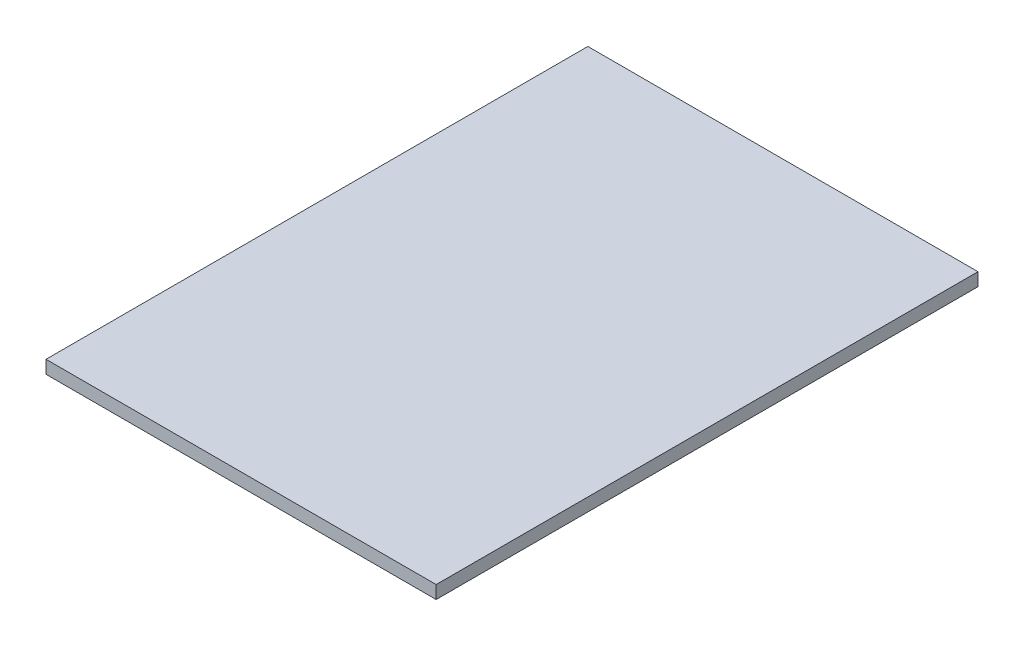
ISO-10303-21;
HEADER;
FILE_DESCRIPTION(('STEP AP214'),'2;1');
FILE_NAME('part.step','',(''),(''),'','','');
FILE_SCHEMA(('AUTOMOTIVE_DESIGN { 1 0 10303 214 1 1 1 1 }'));
ENDSEC;
DATA;
#1=APPLICATION_CONTEXT('core data for automotive mechanical design processes');
#2=APPLICATION_PROTOCOL_DEFINITION('international standard','automotive_design',2000,#1);
#3=PRODUCT_CONTEXT('',#1,'mechanical');
#4=PRODUCT('Part','Part','',(#3));
#5=PRODUCT_RELATED_PRODUCT_CATEGORY('part','',(#4));
#6=PRODUCT_DEFINITION_FORMATION('','',#4);
#7=PRODUCT_DEFINITION_CONTEXT('part definition',#1,'design');
#8=PRODUCT_DEFINITION('design','',#6,#7);
#9=PRODUCT_DEFINITION_SHAPE('','',#8);
#10=(LENGTH_UNIT() NAMED_UNIT(*) SI_UNIT(.MILLI.,.METRE.));
#11=(NAMED_UNIT(*) PLANE_ANGLE_UNIT() SI_UNIT($,.RADIAN.));
#12=(NAMED_UNIT(*) SI_UNIT($,.STERADIAN.) SOLID_ANGLE_UNIT());
#13=UNCERTAINTY_MEASURE_WITH_UNIT(LENGTH_MEASURE(1.E-05),#10,'distance_accuracy_value','');
#14=(GEOMETRIC_REPRESENTATION_CONTEXT(3) GLOBAL_UNCERTAINTY_ASSIGNED_CONTEXT((#13)) GLOBAL_UNIT_ASSIGNED_CONTEXT((#10,
#11,#12)) REPRESENTATION_CONTEXT('',''));
#15=CARTESIAN_POINT('',(0.,0.,0.));
#16=DIRECTION('',(0.,0.,1.));
#17=DIRECTION('',(1.,0.,0.));
#18=AXIS2_PLACEMENT_3D('',#15,#16,#17);
#19=CARTESIAN_POINT('',(-90.,6.,-125.));
#20=DIRECTION('',(1.,0.,0.));
#21=DIRECTION('',(0.,0.,-1.));
#22=AXIS2_PLACEMENT_3D('',#19,#20,#21);
#23=PLANE('',#22);
#24=DIRECTION('',(0.,0.,1.));
#25=VECTOR('',#24,1.);
#26=CARTESIAN_POINT('',(-90.,0.,-125.));
#27=LINE('',#26,#25);
#28=CARTESIAN_POINT('',(-90.,0.,-125.));
#29=VERTEX_POINT('',#28);
#30=CARTESIAN_POINT('',(-90.,0.,125.));
#31=VERTEX_POINT('',#30);
#32=EDGE_CURVE('E107',#29,#31,#27,.T.);
#33=ORIENTED_EDGE('',*,*,#32,.T.);
#34=DIRECTION('',(0.,-1.,0.));
#35=VECTOR('',#34,1.);
#36=CARTESIAN_POINT('',(-90.,6.,125.));
#37=LINE('',#36,#35);
#38=CARTESIAN_POINT('',(-90.,6.,125.));
#39=VERTEX_POINT('',#38);
#40=EDGE_CURVE('E11',#39,#31,#37,.T.);
#41=ORIENTED_EDGE('',*,*,#40,.F.);
#42=DIRECTION('',(0.,0.,1.));
#43=VECTOR('',#42,1.);
#44=CARTESIAN_POINT('',(-90.,6.,-125.));
#45=LINE('',#44,#43);
#46=CARTESIAN_POINT('',(-90.,6.,-125.));
#47=VERTEX_POINT('',#46);
#48=EDGE_CURVE('E91',#47,#39,#45,.T.);
#49=ORIENTED_EDGE('',*,*,#48,.F.);
#50=DIRECTION('',(0.,-1.,0.));
#51=VECTOR('',#50,1.);
#52=CARTESIAN_POINT('',(-90.,6.,-125.));
#53=LINE('',#52,#51);
#54=EDGE_CURVE('E103',#47,#29,#53,.T.);
#55=ORIENTED_EDGE('',*,*,#54,.T.);
#56=EDGE_LOOP('',(#33,#41,#49,#55));
#57=FACE_BOUND('',#56,.T.);
#58=ADVANCED_FACE('F39',(#57),#23,.F.);
#59=CARTESIAN_POINT('',(-90.,6.,125.));
#60=DIRECTION('',(0.,0.,-1.));
#61=DIRECTION('',(-1.,0.,0.));
#62=AXIS2_PLACEMENT_3D('',#59,#60,#61);
#63=PLANE('',#62);
#64=DIRECTION('',(1.,0.,0.));
#65=VECTOR('',#64,1.);
#66=CARTESIAN_POINT('',(-90.,0.,125.));
#67=LINE('',#66,#65);
#68=CARTESIAN_POINT('',(90.,0.,125.));
#69=VERTEX_POINT('',#68);
#70=EDGE_CURVE('E96',#31,#69,#67,.T.);
#71=ORIENTED_EDGE('',*,*,#70,.T.);
#72=DIRECTION('',(0.,-1.,0.));
#73=VECTOR('',#72,1.);
#74=CARTESIAN_POINT('',(90.,6.,125.));
#75=LINE('',#74,#73);
#76=CARTESIAN_POINT('',(90.,6.,125.));
#77=VERTEX_POINT('',#76);
#78=EDGE_CURVE('E48',#77,#69,#75,.T.);
#79=ORIENTED_EDGE('',*,*,#78,.F.);
#80=DIRECTION('',(1.,0.,0.));
#81=VECTOR('',#80,1.);
#82=CARTESIAN_POINT('',(-90.,6.,125.));
#83=LINE('',#82,#81);
#84=EDGE_CURVE('E86',#39,#77,#83,.T.);
#85=ORIENTED_EDGE('',*,*,#84,.F.);
#86=ORIENTED_EDGE('',*,*,#40,.T.);
#87=EDGE_LOOP('',(#71,#79,#85,#86));
#88=FACE_BOUND('',#87,.T.);
#89=ADVANCED_FACE('F95',(#88),#63,.F.);
#90=CARTESIAN_POINT('',(90.,6.,-125.));
#91=DIRECTION('',(-1.,0.,0.));
#92=DIRECTION('',(0.,0.,1.));
#93=AXIS2_PLACEMENT_3D('',#90,#91,#92);
#94=PLANE('',#93);
#95=DIRECTION('',(0.,0.,-1.));
#96=VECTOR('',#95,1.);
#97=CARTESIAN_POINT('',(90.,0.,-125.));
#98=LINE('',#97,#96);
#99=CARTESIAN_POINT('',(90.,0.,-125.));
#100=VERTEX_POINT('',#99);
#101=EDGE_CURVE('E73',#69,#100,#98,.T.);
#102=ORIENTED_EDGE('',*,*,#101,.T.);
#103=DIRECTION('',(0.,-1.,0.));
#104=VECTOR('',#103,1.);
#105=CARTESIAN_POINT('',(90.,6.,-125.));
#106=LINE('',#105,#104);
#107=CARTESIAN_POINT('',(90.,6.,-125.));
#108=VERTEX_POINT('',#107);
#109=EDGE_CURVE('E98',#108,#100,#106,.T.);
#110=ORIENTED_EDGE('',*,*,#109,.F.);
#111=DIRECTION('',(0.,0.,-1.));
#112=VECTOR('',#111,1.);
#113=CARTESIAN_POINT('',(90.,6.,-125.));
#114=LINE('',#113,#112);
#115=EDGE_CURVE('E89',#77,#108,#114,.T.);
#116=ORIENTED_EDGE('',*,*,#115,.F.);
#117=ORIENTED_EDGE('',*,*,#78,.T.);
#118=EDGE_LOOP('',(#102,#110,#116,#117));
#119=FACE_BOUND('',#118,.T.);
#120=ADVANCED_FACE('F99',(#119),#94,.F.);
#121=CARTESIAN_POINT('',(-90.,6.,-125.));
#122=DIRECTION('',(0.,0.,1.));
#123=DIRECTION('',(1.,0.,0.));
#124=AXIS2_PLACEMENT_3D('',#121,#122,#123);
#125=PLANE('',#124);
#126=DIRECTION('',(-1.,0.,0.));
#127=VECTOR('',#126,1.);
#128=CARTESIAN_POINT('',(-90.,0.,-125.));
#129=LINE('',#128,#127);
#130=EDGE_CURVE('E79',#100,#29,#129,.T.);
#131=ORIENTED_EDGE('',*,*,#130,.T.);
#132=ORIENTED_EDGE('',*,*,#54,.F.);
#133=DIRECTION('',(-1.,0.,0.));
#134=VECTOR('',#133,1.);
#135=CARTESIAN_POINT('',(-90.,6.,-125.));
#136=LINE('',#135,#134);
#137=EDGE_CURVE('E56',#108,#47,#136,.T.);
#138=ORIENTED_EDGE('',*,*,#137,.F.);
#139=ORIENTED_EDGE('',*,*,#109,.T.);
#140=EDGE_LOOP('',(#131,#132,#138,#139));
#141=FACE_BOUND('',#140,.T.);
#142=ADVANCED_FACE('F120',(#141),#125,.F.);
#143=CARTESIAN_POINT('',(0.,6.,0.));
#144=DIRECTION('',(0.,1.,0.));
#145=DIRECTION('',(0.,0.,1.));
#146=AXIS2_PLACEMENT_3D('',#143,#144,#145);
#147=PLANE('',#146);
#148=ORIENTED_EDGE('',*,*,#48,.T.);
#149=ORIENTED_EDGE('',*,*,#84,.T.);
#150=ORIENTED_EDGE('',*,*,#115,.T.);
#151=ORIENTED_EDGE('',*,*,#137,.T.);
#152=EDGE_LOOP('',(#148,#149,#150,#151));
#153=FACE_BOUND('',#152,.T.);
#154=ADVANCED_FACE('F87',(#153),#147,.T.);
#155=CARTESIAN_POINT('',(0.,0.,0.));
#156=DIRECTION('',(0.,1.,0.));
#157=DIRECTION('',(0.,0.,1.));
#158=AXIS2_PLACEMENT_3D('',#155,#156,#157);
#159=PLANE('',#158);
#160=ORIENTED_EDGE('',*,*,#32,.F.);
#161=ORIENTED_EDGE('',*,*,#130,.F.);
#162=ORIENTED_EDGE('',*,*,#101,.F.);
#163=ORIENTED_EDGE('',*,*,#70,.F.);
#164=EDGE_LOOP('',(#160,#161,#162,#163));
#165=FACE_BOUND('',#164,.T.);
#166=ADVANCED_FACE('F123',(#165),#159,.F.);
#167=CLOSED_SHELL('',(#58,#89,#120,#142,#154,#166));
#168=MANIFOLD_SOLID_BREP('B2',#167);
#169=ADVANCED_BREP_SHAPE_REPRESENTATION('',(#18,#168),#14);
#170=SHAPE_DEFINITION_REPRESENTATION(#9,#169);
ENDSEC;
END-ISO-10303-21;
